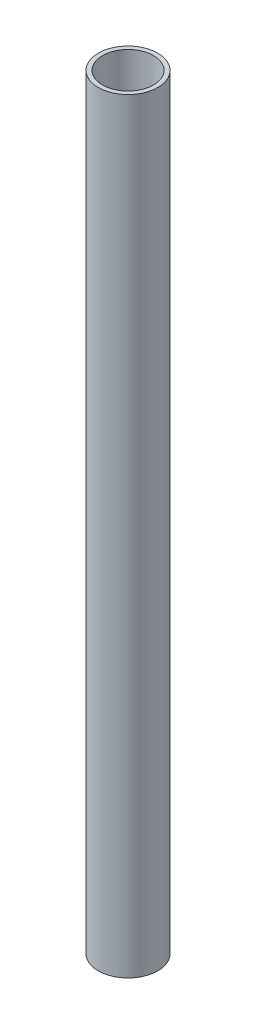
ISO-10303-21;
HEADER;
FILE_DESCRIPTION(('STEP AP214'),'2;1');
FILE_NAME('part.step','',(''),(''),'','','');
FILE_SCHEMA(('AUTOMOTIVE_DESIGN { 1 0 10303 214 1 1 1 1 }'));
ENDSEC;
DATA;
#1=APPLICATION_CONTEXT('core data for automotive mechanical design processes');
#2=APPLICATION_PROTOCOL_DEFINITION('international standard','automotive_design',2000,#1);
#3=PRODUCT_CONTEXT('',#1,'mechanical');
#4=PRODUCT('Part','Part','',(#3));
#5=PRODUCT_RELATED_PRODUCT_CATEGORY('part','',(#4));
#6=PRODUCT_DEFINITION_FORMATION('','',#4);
#7=PRODUCT_DEFINITION_CONTEXT('part definition',#1,'design');
#8=PRODUCT_DEFINITION('design','',#6,#7);
#9=PRODUCT_DEFINITION_SHAPE('','',#8);
#10=(LENGTH_UNIT() NAMED_UNIT(*) SI_UNIT(.MILLI.,.METRE.));
#11=(NAMED_UNIT(*) PLANE_ANGLE_UNIT() SI_UNIT($,.RADIAN.));
#12=(NAMED_UNIT(*) SI_UNIT($,.STERADIAN.) SOLID_ANGLE_UNIT());
#13=UNCERTAINTY_MEASURE_WITH_UNIT(LENGTH_MEASURE(1.E-05),#10,'distance_accuracy_value','');
#14=(GEOMETRIC_REPRESENTATION_CONTEXT(3) GLOBAL_UNCERTAINTY_ASSIGNED_CONTEXT((#13)) GLOBAL_UNIT_ASSIGNED_CONTEXT((#10,
#11,#12)) REPRESENTATION_CONTEXT('',''));
#15=CARTESIAN_POINT('',(0.,0.,0.));
#16=DIRECTION('',(0.,0.,1.));
#17=DIRECTION('',(1.,0.,0.));
#18=AXIS2_PLACEMENT_3D('',#15,#16,#17);
#19=CARTESIAN_POINT('',(0.,270.,0.));
#20=DIRECTION('',(0.,1.,0.));
#21=DIRECTION('',(0.,0.,1.));
#22=AXIS2_PLACEMENT_3D('',#19,#20,#21);
#23=PLANE('',#22);
#24=CARTESIAN_POINT('',(0.,270.,0.));
#25=DIRECTION('',(0.,1.,0.));
#26=DIRECTION('',(1.,0.,0.));
#27=AXIS2_PLACEMENT_3D('',#24,#25,#26);
#28=CIRCLE('',#27,10.5);
#29=CARTESIAN_POINT('',(10.5,270.,0.));
#30=VERTEX_POINT('',#29);
#31=EDGE_CURVE('E11',#30,#30,#28,.T.);
#32=ORIENTED_EDGE('',*,*,#31,.T.);
#33=EDGE_LOOP('',(#32));
#34=FACE_BOUND('',#33,.T.);
#35=CARTESIAN_POINT('',(0.,270.,0.));
#36=DIRECTION('',(0.,1.,0.));
#37=DIRECTION('',(0.,0.,1.));
#38=AXIS2_PLACEMENT_3D('',#35,#36,#37);
#39=CIRCLE('',#38,9.);
#40=CARTESIAN_POINT('',(0.,270.,9.));
#41=VERTEX_POINT('',#40);
#42=EDGE_CURVE('E58',#41,#41,#39,.T.);
#43=ORIENTED_EDGE('',*,*,#42,.F.);
#44=EDGE_LOOP('',(#43));
#45=FACE_BOUND('',#44,.T.);
#46=ADVANCED_FACE('F45',(#34,#45),#23,.T.);
#47=CARTESIAN_POINT('',(0.,0.,0.));
#48=DIRECTION('',(0.,1.,0.));
#49=DIRECTION('',(0.,0.,1.));
#50=AXIS2_PLACEMENT_3D('',#47,#48,#49);
#51=PLANE('',#50);
#52=CARTESIAN_POINT('',(0.,0.,0.));
#53=DIRECTION('',(0.,1.,0.));
#54=DIRECTION('',(1.,0.,0.));
#55=AXIS2_PLACEMENT_3D('',#52,#53,#54);
#56=CIRCLE('',#55,10.5);
#57=CARTESIAN_POINT('',(10.5,0.,0.));
#58=VERTEX_POINT('',#57);
#59=EDGE_CURVE('E49',#58,#58,#56,.T.);
#60=ORIENTED_EDGE('',*,*,#59,.F.);
#61=EDGE_LOOP('',(#60));
#62=FACE_BOUND('',#61,.T.);
#63=CARTESIAN_POINT('',(0.,0.,0.));
#64=DIRECTION('',(0.,1.,0.));
#65=DIRECTION('',(0.,0.,1.));
#66=AXIS2_PLACEMENT_3D('',#63,#64,#65);
#67=CIRCLE('',#66,9.);
#68=CARTESIAN_POINT('',(0.,0.,9.));
#69=VERTEX_POINT('',#68);
#70=EDGE_CURVE('E60',#69,#69,#67,.T.);
#71=ORIENTED_EDGE('',*,*,#70,.T.);
#72=EDGE_LOOP('',(#71));
#73=FACE_BOUND('',#72,.T.);
#74=ADVANCED_FACE('F72',(#62,#73),#51,.F.);
#75=CARTESIAN_POINT('',(0.,270.,0.));
#76=DIRECTION('',(0.,-1.,0.));
#77=DIRECTION('',(0.,0.,-1.));
#78=AXIS2_PLACEMENT_3D('',#75,#76,#77);
#79=CYLINDRICAL_SURFACE('',#78,10.5);
#80=ORIENTED_EDGE('',*,*,#31,.F.);
#81=EDGE_LOOP('',(#80));
#82=FACE_BOUND('',#81,.T.);
#83=ORIENTED_EDGE('',*,*,#59,.T.);
#84=EDGE_LOOP('',(#83));
#85=FACE_BOUND('',#84,.T.);
#86=ADVANCED_FACE('F47',(#82,#85),#79,.T.);
#87=CARTESIAN_POINT('',(0.,270.,0.));
#88=DIRECTION('',(0.,-1.,0.));
#89=DIRECTION('',(0.,0.,-1.));
#90=AXIS2_PLACEMENT_3D('',#87,#88,#89);
#91=CYLINDRICAL_SURFACE('',#90,9.);
#92=ORIENTED_EDGE('',*,*,#42,.T.);
#93=EDGE_LOOP('',(#92));
#94=FACE_BOUND('',#93,.T.);
#95=ORIENTED_EDGE('',*,*,#70,.F.);
#96=EDGE_LOOP('',(#95));
#97=FACE_BOUND('',#96,.T.);
#98=ADVANCED_FACE('F68',(#94,#97),#91,.F.);
#99=CLOSED_SHELL('',(#46,#74,#86,#98));
#100=MANIFOLD_SOLID_BREP('B2',#99);
#101=ADVANCED_BREP_SHAPE_REPRESENTATION('',(#18,#100),#14);
#102=SHAPE_DEFINITION_REPRESENTATION(#9,#101);
ENDSEC;
END-ISO-10303-21;
